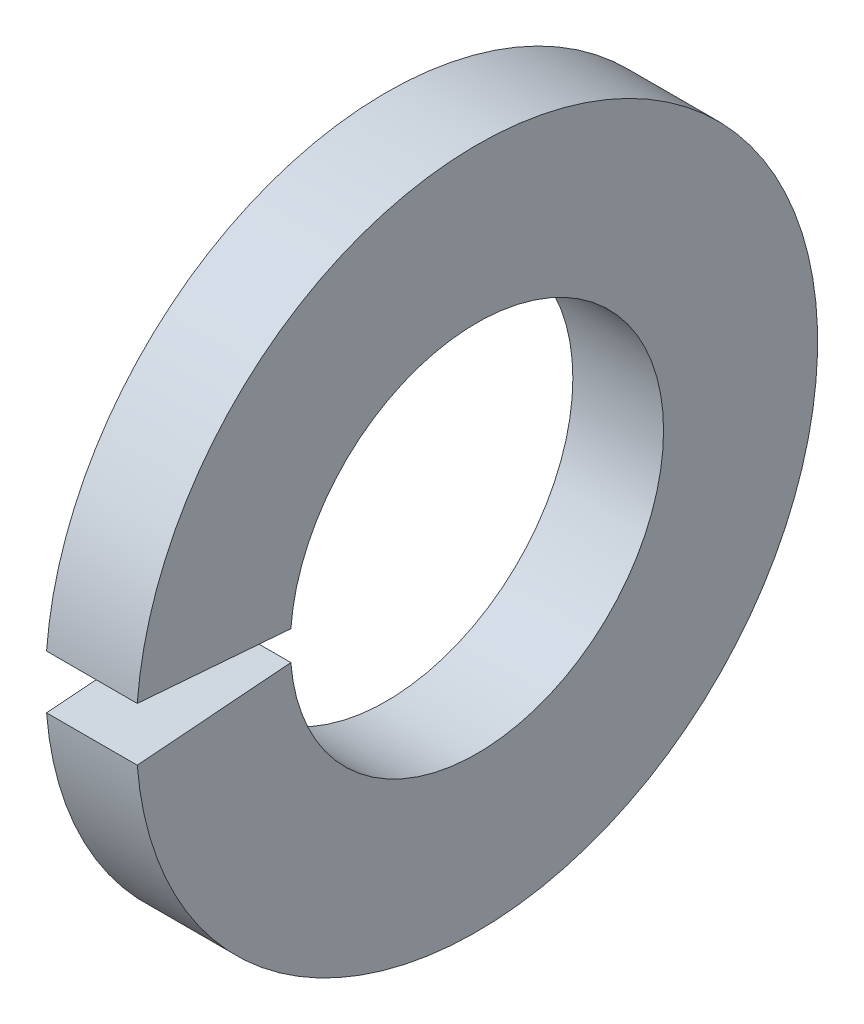
ISO-10303-21;
HEADER;
FILE_DESCRIPTION(('STEP AP214'),'2;1');
FILE_NAME('part.step','',(''),(''),'','','');
FILE_SCHEMA(('AUTOMOTIVE_DESIGN { 1 0 10303 214 1 1 1 1 }'));
ENDSEC;
DATA;
#1=APPLICATION_CONTEXT('core data for automotive mechanical design processes');
#2=APPLICATION_PROTOCOL_DEFINITION('international standard','automotive_design',2000,#1);
#3=PRODUCT_CONTEXT('',#1,'mechanical');
#4=PRODUCT('Part','Part','',(#3));
#5=PRODUCT_RELATED_PRODUCT_CATEGORY('part','',(#4));
#6=PRODUCT_DEFINITION_FORMATION('','',#4);
#7=PRODUCT_DEFINITION_CONTEXT('part definition',#1,'design');
#8=PRODUCT_DEFINITION('design','',#6,#7);
#9=PRODUCT_DEFINITION_SHAPE('','',#8);
#10=(LENGTH_UNIT() NAMED_UNIT(*) SI_UNIT(.MILLI.,.METRE.));
#11=(NAMED_UNIT(*) PLANE_ANGLE_UNIT() SI_UNIT($,.RADIAN.));
#12=(NAMED_UNIT(*) SI_UNIT($,.STERADIAN.) SOLID_ANGLE_UNIT());
#13=UNCERTAINTY_MEASURE_WITH_UNIT(LENGTH_MEASURE(1.E-05),#10,'distance_accuracy_value','');
#14=(GEOMETRIC_REPRESENTATION_CONTEXT(3) GLOBAL_UNCERTAINTY_ASSIGNED_CONTEXT((#13)) GLOBAL_UNIT_ASSIGNED_CONTEXT((#10,
#11,#12)) REPRESENTATION_CONTEXT('',''));
#15=CARTESIAN_POINT('',(0.,0.,0.));
#16=DIRECTION('',(0.,0.,1.));
#17=DIRECTION('',(1.,0.,0.));
#18=AXIS2_PLACEMENT_3D('',#15,#16,#17);
#19=CARTESIAN_POINT('',(-1.9812,0.319854195553704,4.06413289442984));
#20=DIRECTION('',(-1.,0.,0.));
#21=DIRECTION('',(0.,0.,1.));
#22=AXIS2_PLACEMENT_3D('',#19,#20,#21);
#23=PLANE('',#22);
#24=CARTESIAN_POINT('',(-1.9812,0.,0.));
#25=DIRECTION('',(-1.,0.,0.));
#26=DIRECTION('',(0.,0.,1.));
#27=AXIS2_PLACEMENT_3D('',#24,#25,#26);
#28=CIRCLE('',#27,7.4422);
#29=CARTESIAN_POINT('',(-1.9812,0.583908282225764,7.41925818110868));
#30=VERTEX_POINT('',#29);
#31=CARTESIAN_POINT('',(-1.9812,-0.583908282225772,7.41925818110868));
#32=VERTEX_POINT('',#31);
#33=EDGE_CURVE('E11',#30,#32,#28,.T.);
#34=ORIENTED_EDGE('',*,*,#33,.T.);
#35=DIRECTION('',(0.,-0.0784590957278456,0.996917333733128));
#36=VECTOR('',#35,1.);
#37=CARTESIAN_POINT('',(-1.9812,-0.319854195553708,4.06413289442984));
#38=LINE('',#37,#36);
#39=CARTESIAN_POINT('',(-1.9812,-0.319854195553708,4.06413289442984));
#40=VERTEX_POINT('',#39);
#41=EDGE_CURVE('E73',#40,#32,#38,.T.);
#42=ORIENTED_EDGE('',*,*,#41,.F.);
#43=CARTESIAN_POINT('',(-1.9812,0.,0.));
#44=DIRECTION('',(-1.,0.,0.));
#45=DIRECTION('',(0.,0.,1.));
#46=AXIS2_PLACEMENT_3D('',#43,#44,#45);
#47=CIRCLE('',#46,4.0767);
#48=CARTESIAN_POINT('',(-1.9812,0.319854195553704,4.06413289442984));
#49=VERTEX_POINT('',#48);
#50=EDGE_CURVE('E48',#49,#40,#47,.T.);
#51=ORIENTED_EDGE('',*,*,#50,.F.);
#52=DIRECTION('',(0.,0.0784590957278445,0.996917333733128));
#53=VECTOR('',#52,1.);
#54=CARTESIAN_POINT('',(-1.9812,0.319854195553704,4.06413289442984));
#55=LINE('',#54,#53);
#56=EDGE_CURVE('E75',#49,#30,#55,.T.);
#57=ORIENTED_EDGE('',*,*,#56,.T.);
#58=EDGE_LOOP('',(#34,#42,#51,#57));
#59=FACE_BOUND('',#58,.T.);
#60=ADVANCED_FACE('F33',(#59),#23,.T.);
#61=CARTESIAN_POINT('',(0.,0.,0.));
#62=DIRECTION('',(-1.,0.,0.));
#63=DIRECTION('',(0.,0.,1.));
#64=AXIS2_PLACEMENT_3D('',#61,#62,#63);
#65=CYLINDRICAL_SURFACE('',#64,7.4422);
#66=CARTESIAN_POINT('',(0.,0.,0.));
#67=DIRECTION('',(-1.,0.,0.));
#68=DIRECTION('',(0.,0.,1.));
#69=AXIS2_PLACEMENT_3D('',#66,#67,#68);
#70=CIRCLE('',#69,7.4422);
#71=CARTESIAN_POINT('',(0.,0.583908282225764,7.41925818110868));
#72=VERTEX_POINT('',#71);
#73=CARTESIAN_POINT('',(0.,-0.583908282225772,7.41925818110868));
#74=VERTEX_POINT('',#73);
#75=EDGE_CURVE('E41',#72,#74,#70,.T.);
#76=ORIENTED_EDGE('',*,*,#75,.T.);
#77=DIRECTION('',(1.,0.,0.));
#78=VECTOR('',#77,1.);
#79=CARTESIAN_POINT('',(-1.9812,-0.583908282225772,7.41925818110868));
#80=LINE('',#79,#78);
#81=EDGE_CURVE('E84',#32,#74,#80,.T.);
#82=ORIENTED_EDGE('',*,*,#81,.F.);
#83=ORIENTED_EDGE('',*,*,#33,.F.);
#84=DIRECTION('',(1.,0.,0.));
#85=VECTOR('',#84,1.);
#86=CARTESIAN_POINT('',(-1.9812,0.583908282225764,7.41925818110868));
#87=LINE('',#86,#85);
#88=EDGE_CURVE('E94',#30,#72,#87,.T.);
#89=ORIENTED_EDGE('',*,*,#88,.T.);
#90=EDGE_LOOP('',(#76,#82,#83,#89));
#91=FACE_BOUND('',#90,.T.);
#92=ADVANCED_FACE('F35',(#91),#65,.T.);
#93=CARTESIAN_POINT('',(0.,0.583908282225764,7.41925818110868));
#94=DIRECTION('',(1.,0.,0.));
#95=DIRECTION('',(0.,0.,-1.));
#96=AXIS2_PLACEMENT_3D('',#93,#94,#95);
#97=PLANE('',#96);
#98=CARTESIAN_POINT('',(0.,0.,0.));
#99=DIRECTION('',(-1.,0.,0.));
#100=DIRECTION('',(0.,0.,1.));
#101=AXIS2_PLACEMENT_3D('',#98,#99,#100);
#102=CIRCLE('',#101,4.0767);
#103=CARTESIAN_POINT('',(0.,0.319854195553704,4.06413289442984));
#104=VERTEX_POINT('',#103);
#105=CARTESIAN_POINT('',(0.,-0.319854195553708,4.06413289442984));
#106=VERTEX_POINT('',#105);
#107=EDGE_CURVE('E56',#104,#106,#102,.T.);
#108=ORIENTED_EDGE('',*,*,#107,.T.);
#109=DIRECTION('',(0.,0.0784590957278456,-0.996917333733128));
#110=VECTOR('',#109,1.);
#111=CARTESIAN_POINT('',(0.,-0.583908282225772,7.41925818110868));
#112=LINE('',#111,#110);
#113=EDGE_CURVE('E88',#74,#106,#112,.T.);
#114=ORIENTED_EDGE('',*,*,#113,.F.);
#115=ORIENTED_EDGE('',*,*,#75,.F.);
#116=DIRECTION('',(0.,-0.0784590957278445,-0.996917333733128));
#117=VECTOR('',#116,1.);
#118=CARTESIAN_POINT('',(0.,0.583908282225764,7.41925818110868));
#119=LINE('',#118,#117);
#120=EDGE_CURVE('E96',#72,#104,#119,.T.);
#121=ORIENTED_EDGE('',*,*,#120,.T.);
#122=EDGE_LOOP('',(#108,#114,#115,#121));
#123=FACE_BOUND('',#122,.T.);
#124=ADVANCED_FACE('F102',(#123),#97,.T.);
#125=CARTESIAN_POINT('',(0.,0.,0.));
#126=DIRECTION('',(-1.,0.,0.));
#127=DIRECTION('',(0.,0.,1.));
#128=AXIS2_PLACEMENT_3D('',#125,#126,#127);
#129=CYLINDRICAL_SURFACE('',#128,4.0767);
#130=DIRECTION('',(-1.,0.,0.));
#131=VECTOR('',#130,1.);
#132=CARTESIAN_POINT('',(0.,0.319854195553704,4.06413289442984));
#133=LINE('',#132,#131);
#134=EDGE_CURVE('E98',#104,#49,#133,.T.);
#135=ORIENTED_EDGE('',*,*,#134,.T.);
#136=ORIENTED_EDGE('',*,*,#50,.T.);
#137=DIRECTION('',(-1.,0.,0.));
#138=VECTOR('',#137,1.);
#139=CARTESIAN_POINT('',(0.,-0.319854195553708,4.06413289442984));
#140=LINE('',#139,#138);
#141=EDGE_CURVE('E86',#106,#40,#140,.T.);
#142=ORIENTED_EDGE('',*,*,#141,.F.);
#143=ORIENTED_EDGE('',*,*,#107,.F.);
#144=EDGE_LOOP('',(#135,#136,#142,#143));
#145=FACE_BOUND('',#144,.T.);
#146=ADVANCED_FACE('F105',(#145),#129,.F.);
#147=CARTESIAN_POINT('',(0.,0.,0.));
#148=DIRECTION('',(0.,0.996917333733128,-0.0784590957278445));
#149=DIRECTION('',(0.,0.0784590957278445,0.996917333733128));
#150=AXIS2_PLACEMENT_3D('',#147,#148,#149);
#151=PLANE('',#150);
#152=ORIENTED_EDGE('',*,*,#56,.F.);
#153=ORIENTED_EDGE('',*,*,#134,.F.);
#154=ORIENTED_EDGE('',*,*,#120,.F.);
#155=ORIENTED_EDGE('',*,*,#88,.F.);
#156=EDGE_LOOP('',(#152,#153,#154,#155));
#157=FACE_BOUND('',#156,.T.);
#158=ADVANCED_FACE('F107',(#157),#151,.F.);
#159=CARTESIAN_POINT('',(0.,0.,0.));
#160=DIRECTION('',(0.,0.996917333733128,0.0784590957278456));
#161=DIRECTION('',(0.,-0.0784590957278456,0.996917333733128));
#162=AXIS2_PLACEMENT_3D('',#159,#160,#161);
#163=PLANE('',#162);
#164=ORIENTED_EDGE('',*,*,#41,.T.);
#165=ORIENTED_EDGE('',*,*,#81,.T.);
#166=ORIENTED_EDGE('',*,*,#113,.T.);
#167=ORIENTED_EDGE('',*,*,#141,.T.);
#168=EDGE_LOOP('',(#164,#165,#166,#167));
#169=FACE_BOUND('',#168,.T.);
#170=ADVANCED_FACE('F82',(#169),#163,.T.);
#171=CLOSED_SHELL('',(#60,#92,#124,#146,#158,#170));
#172=MANIFOLD_SOLID_BREP('B2',#171);
#173=ADVANCED_BREP_SHAPE_REPRESENTATION('',(#18,#172),#14);
#174=SHAPE_DEFINITION_REPRESENTATION(#9,#173);
ENDSEC;
END-ISO-10303-21;
